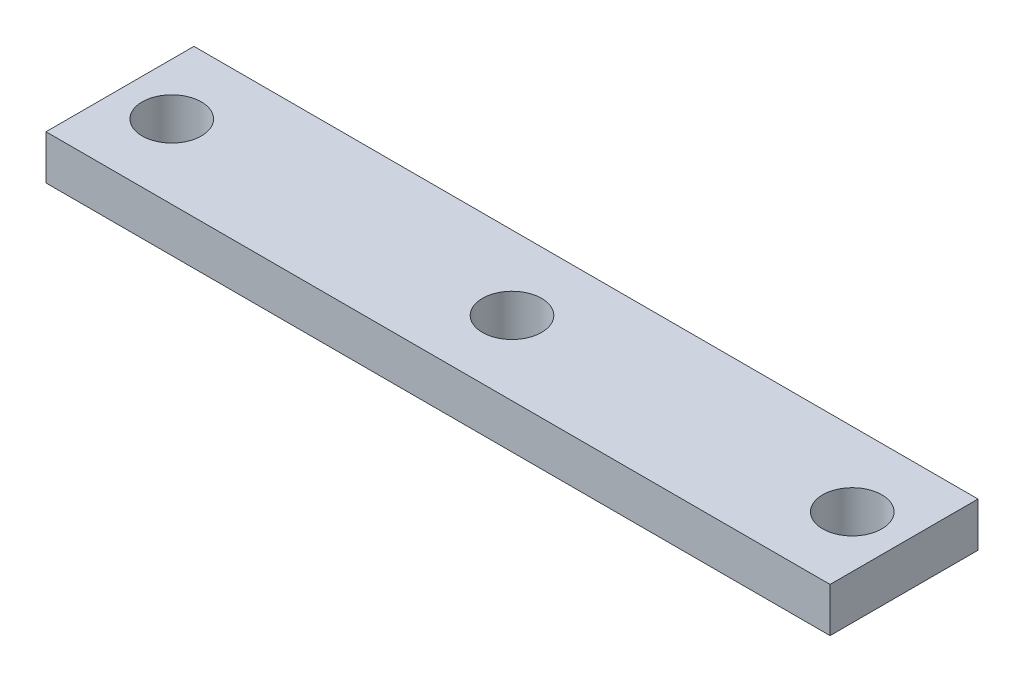
ISO-10303-21;
HEADER;
FILE_DESCRIPTION(('STEP AP214'),'2;1');
FILE_NAME('part.step','',(''),(''),'','','');
FILE_SCHEMA(('AUTOMOTIVE_DESIGN { 1 0 10303 214 1 1 1 1 }'));
ENDSEC;
DATA;
#1=APPLICATION_CONTEXT('core data for automotive mechanical design processes');
#2=APPLICATION_PROTOCOL_DEFINITION('international standard','automotive_design',2000,#1);
#3=PRODUCT_CONTEXT('',#1,'mechanical');
#4=PRODUCT('Part','Part','',(#3));
#5=PRODUCT_RELATED_PRODUCT_CATEGORY('part','',(#4));
#6=PRODUCT_DEFINITION_FORMATION('','',#4);
#7=PRODUCT_DEFINITION_CONTEXT('part definition',#1,'design');
#8=PRODUCT_DEFINITION('design','',#6,#7);
#9=PRODUCT_DEFINITION_SHAPE('','',#8);
#10=(LENGTH_UNIT() NAMED_UNIT(*) SI_UNIT(.MILLI.,.METRE.));
#11=(NAMED_UNIT(*) PLANE_ANGLE_UNIT() SI_UNIT($,.RADIAN.));
#12=(NAMED_UNIT(*) SI_UNIT($,.STERADIAN.) SOLID_ANGLE_UNIT());
#13=UNCERTAINTY_MEASURE_WITH_UNIT(LENGTH_MEASURE(1.E-05),#10,'distance_accuracy_value','');
#14=(GEOMETRIC_REPRESENTATION_CONTEXT(3) GLOBAL_UNCERTAINTY_ASSIGNED_CONTEXT((#13)) GLOBAL_UNIT_ASSIGNED_CONTEXT((#10,
#11,#12)) REPRESENTATION_CONTEXT('',''));
#15=CARTESIAN_POINT('',(0.,0.,0.));
#16=DIRECTION('',(0.,0.,1.));
#17=DIRECTION('',(1.,0.,0.));
#18=AXIS2_PLACEMENT_3D('',#15,#16,#17);
#19=CARTESIAN_POINT('',(0.,3.,0.));
#20=DIRECTION('',(0.,-1.,0.));
#21=DIRECTION('',(0.,0.,-1.));
#22=AXIS2_PLACEMENT_3D('',#19,#20,#21);
#23=PLANE('',#22);
#24=DIRECTION('',(0.,0.,-1.));
#25=VECTOR('',#24,1.);
#26=CARTESIAN_POINT('',(26.5,3.,5.));
#27=LINE('',#26,#25);
#28=CARTESIAN_POINT('',(26.5,3.,5.));
#29=VERTEX_POINT('',#28);
#30=CARTESIAN_POINT('',(26.5,3.,-5.));
#31=VERTEX_POINT('',#30);
#32=EDGE_CURVE('E85',#29,#31,#27,.T.);
#33=ORIENTED_EDGE('',*,*,#32,.T.);
#34=DIRECTION('',(-1.,0.,0.));
#35=VECTOR('',#34,1.);
#36=CARTESIAN_POINT('',(-26.5,3.,-5.));
#37=LINE('',#36,#35);
#38=CARTESIAN_POINT('',(-26.5,3.,-5.));
#39=VERTEX_POINT('',#38);
#40=EDGE_CURVE('E80',#31,#39,#37,.T.);
#41=ORIENTED_EDGE('',*,*,#40,.T.);
#42=DIRECTION('',(0.,0.,1.));
#43=VECTOR('',#42,1.);
#44=CARTESIAN_POINT('',(-26.5,3.,5.));
#45=LINE('',#44,#43);
#46=CARTESIAN_POINT('',(-26.5,3.,5.));
#47=VERTEX_POINT('',#46);
#48=EDGE_CURVE('E83',#39,#47,#45,.T.);
#49=ORIENTED_EDGE('',*,*,#48,.T.);
#50=DIRECTION('',(1.,0.,0.));
#51=VECTOR('',#50,1.);
#52=CARTESIAN_POINT('',(-26.5,3.,5.));
#53=LINE('',#52,#51);
#54=EDGE_CURVE('E50',#47,#29,#53,.T.);
#55=ORIENTED_EDGE('',*,*,#54,.T.);
#56=EDGE_LOOP('',(#33,#41,#49,#55));
#57=FACE_BOUND('',#56,.T.);
#58=CARTESIAN_POINT('',(-23.,3.,0.));
#59=DIRECTION('',(0.,1.,0.));
#60=DIRECTION('',(0.,0.,1.));
#61=AXIS2_PLACEMENT_3D('',#58,#59,#60);
#62=CIRCLE('',#61,2.00000000000001);
#63=CARTESIAN_POINT('',(-23.,3.,2.00000000000001));
#64=VERTEX_POINT('',#63);
#65=EDGE_CURVE('E100',#64,#64,#62,.T.);
#66=ORIENTED_EDGE('',*,*,#65,.F.);
#67=EDGE_LOOP('',(#66));
#68=FACE_BOUND('',#67,.T.);
#69=CARTESIAN_POINT('',(23.,3.,0.));
#70=DIRECTION('',(0.,1.,0.));
#71=DIRECTION('',(0.,0.,1.));
#72=AXIS2_PLACEMENT_3D('',#69,#70,#71);
#73=CIRCLE('',#72,2.00000000000001);
#74=CARTESIAN_POINT('',(23.,3.,2.));
#75=VERTEX_POINT('',#74);
#76=EDGE_CURVE('E115',#75,#75,#73,.T.);
#77=ORIENTED_EDGE('',*,*,#76,.F.);
#78=EDGE_LOOP('',(#77));
#79=FACE_BOUND('',#78,.T.);
#80=CARTESIAN_POINT('',(0.,3.,0.));
#81=DIRECTION('',(0.,1.,0.));
#82=DIRECTION('',(0.,0.,1.));
#83=AXIS2_PLACEMENT_3D('',#80,#81,#82);
#84=CIRCLE('',#83,2.);
#85=CARTESIAN_POINT('',(0.,3.,2.));
#86=VERTEX_POINT('',#85);
#87=EDGE_CURVE('E121',#86,#86,#84,.T.);
#88=ORIENTED_EDGE('',*,*,#87,.F.);
#89=EDGE_LOOP('',(#88));
#90=FACE_BOUND('',#89,.T.);
#91=ADVANCED_FACE('F33',(#57,#68,#79,#90),#23,.F.);
#92=CARTESIAN_POINT('',(0.,0.,0.));
#93=DIRECTION('',(0.,-1.,0.));
#94=DIRECTION('',(0.,0.,-1.));
#95=AXIS2_PLACEMENT_3D('',#92,#93,#94);
#96=PLANE('',#95);
#97=CARTESIAN_POINT('',(23.,0.,0.));
#98=DIRECTION('',(0.,1.,0.));
#99=DIRECTION('',(0.,0.,1.));
#100=AXIS2_PLACEMENT_3D('',#97,#98,#99);
#101=CIRCLE('',#100,2.00000000000001);
#102=CARTESIAN_POINT('',(23.,0.,2.));
#103=VERTEX_POINT('',#102);
#104=EDGE_CURVE('E118',#103,#103,#101,.T.);
#105=ORIENTED_EDGE('',*,*,#104,.T.);
#106=EDGE_LOOP('',(#105));
#107=FACE_BOUND('',#106,.T.);
#108=DIRECTION('',(0.,0.,-1.));
#109=VECTOR('',#108,1.);
#110=CARTESIAN_POINT('',(26.5,0.,5.));
#111=LINE('',#110,#109);
#112=CARTESIAN_POINT('',(26.5,0.,5.));
#113=VERTEX_POINT('',#112);
#114=CARTESIAN_POINT('',(26.5,0.,-5.));
#115=VERTEX_POINT('',#114);
#116=EDGE_CURVE('E97',#113,#115,#111,.T.);
#117=ORIENTED_EDGE('',*,*,#116,.F.);
#118=DIRECTION('',(1.,0.,0.));
#119=VECTOR('',#118,1.);
#120=CARTESIAN_POINT('',(-26.5,0.,5.));
#121=LINE('',#120,#119);
#122=CARTESIAN_POINT('',(-26.5,0.,5.));
#123=VERTEX_POINT('',#122);
#124=EDGE_CURVE('E73',#123,#113,#121,.T.);
#125=ORIENTED_EDGE('',*,*,#124,.F.);
#126=DIRECTION('',(0.,0.,1.));
#127=VECTOR('',#126,1.);
#128=CARTESIAN_POINT('',(-26.5,0.,5.));
#129=LINE('',#128,#127);
#130=CARTESIAN_POINT('',(-26.5,0.,-5.));
#131=VERTEX_POINT('',#130);
#132=EDGE_CURVE('E67',#131,#123,#129,.T.);
#133=ORIENTED_EDGE('',*,*,#132,.F.);
#134=DIRECTION('',(-1.,0.,0.));
#135=VECTOR('',#134,1.);
#136=CARTESIAN_POINT('',(-26.5,0.,-5.));
#137=LINE('',#136,#135);
#138=EDGE_CURVE('E89',#115,#131,#137,.T.);
#139=ORIENTED_EDGE('',*,*,#138,.F.);
#140=EDGE_LOOP('',(#117,#125,#133,#139));
#141=FACE_BOUND('',#140,.T.);
#142=CARTESIAN_POINT('',(-23.,0.,0.));
#143=DIRECTION('',(0.,1.,0.));
#144=DIRECTION('',(0.,0.,1.));
#145=AXIS2_PLACEMENT_3D('',#142,#143,#144);
#146=CIRCLE('',#145,2.00000000000001);
#147=CARTESIAN_POINT('',(-23.,0.,2.00000000000001));
#148=VERTEX_POINT('',#147);
#149=EDGE_CURVE('E112',#148,#148,#146,.T.);
#150=ORIENTED_EDGE('',*,*,#149,.T.);
#151=EDGE_LOOP('',(#150));
#152=FACE_BOUND('',#151,.T.);
#153=CARTESIAN_POINT('',(0.,0.,0.));
#154=DIRECTION('',(0.,1.,0.));
#155=DIRECTION('',(0.,0.,1.));
#156=AXIS2_PLACEMENT_3D('',#153,#154,#155);
#157=CIRCLE('',#156,2.);
#158=CARTESIAN_POINT('',(0.,0.,2.));
#159=VERTEX_POINT('',#158);
#160=EDGE_CURVE('E124',#159,#159,#157,.T.);
#161=ORIENTED_EDGE('',*,*,#160,.T.);
#162=EDGE_LOOP('',(#161));
#163=FACE_BOUND('',#162,.T.);
#164=ADVANCED_FACE('F108',(#107,#141,#152,#163),#96,.T.);
#165=CARTESIAN_POINT('',(26.5,3.,5.));
#166=DIRECTION('',(-1.,0.,0.));
#167=DIRECTION('',(0.,0.,1.));
#168=AXIS2_PLACEMENT_3D('',#165,#166,#167);
#169=PLANE('',#168);
#170=ORIENTED_EDGE('',*,*,#116,.T.);
#171=DIRECTION('',(0.,-1.,0.));
#172=VECTOR('',#171,1.);
#173=CARTESIAN_POINT('',(26.5,3.,-5.));
#174=LINE('',#173,#172);
#175=EDGE_CURVE('E11',#31,#115,#174,.T.);
#176=ORIENTED_EDGE('',*,*,#175,.F.);
#177=ORIENTED_EDGE('',*,*,#32,.F.);
#178=DIRECTION('',(0.,-1.,0.));
#179=VECTOR('',#178,1.);
#180=CARTESIAN_POINT('',(26.5,3.,5.));
#181=LINE('',#180,#179);
#182=EDGE_CURVE('E93',#29,#113,#181,.T.);
#183=ORIENTED_EDGE('',*,*,#182,.T.);
#184=EDGE_LOOP('',(#170,#176,#177,#183));
#185=FACE_BOUND('',#184,.T.);
#186=ADVANCED_FACE('F35',(#185),#169,.F.);
#187=CARTESIAN_POINT('',(-26.5,3.,-5.));
#188=DIRECTION('',(0.,0.,1.));
#189=DIRECTION('',(1.,0.,0.));
#190=AXIS2_PLACEMENT_3D('',#187,#188,#189);
#191=PLANE('',#190);
#192=ORIENTED_EDGE('',*,*,#138,.T.);
#193=DIRECTION('',(0.,-1.,0.));
#194=VECTOR('',#193,1.);
#195=CARTESIAN_POINT('',(-26.5,3.,-5.));
#196=LINE('',#195,#194);
#197=EDGE_CURVE('E42',#39,#131,#196,.T.);
#198=ORIENTED_EDGE('',*,*,#197,.F.);
#199=ORIENTED_EDGE('',*,*,#40,.F.);
#200=ORIENTED_EDGE('',*,*,#175,.T.);
#201=EDGE_LOOP('',(#192,#198,#199,#200));
#202=FACE_BOUND('',#201,.T.);
#203=ADVANCED_FACE('F88',(#202),#191,.F.);
#204=CARTESIAN_POINT('',(-26.5,3.,5.));
#205=DIRECTION('',(1.,0.,0.));
#206=DIRECTION('',(0.,0.,-1.));
#207=AXIS2_PLACEMENT_3D('',#204,#205,#206);
#208=PLANE('',#207);
#209=ORIENTED_EDGE('',*,*,#132,.T.);
#210=DIRECTION('',(0.,-1.,0.));
#211=VECTOR('',#210,1.);
#212=CARTESIAN_POINT('',(-26.5,3.,5.));
#213=LINE('',#212,#211);
#214=EDGE_CURVE('E90',#47,#123,#213,.T.);
#215=ORIENTED_EDGE('',*,*,#214,.F.);
#216=ORIENTED_EDGE('',*,*,#48,.F.);
#217=ORIENTED_EDGE('',*,*,#197,.T.);
#218=EDGE_LOOP('',(#209,#215,#216,#217));
#219=FACE_BOUND('',#218,.T.);
#220=ADVANCED_FACE('F91',(#219),#208,.F.);
#221=CARTESIAN_POINT('',(-26.5,3.,5.));
#222=DIRECTION('',(0.,0.,-1.));
#223=DIRECTION('',(-1.,0.,0.));
#224=AXIS2_PLACEMENT_3D('',#221,#222,#223);
#225=PLANE('',#224);
#226=ORIENTED_EDGE('',*,*,#124,.T.);
#227=ORIENTED_EDGE('',*,*,#182,.F.);
#228=ORIENTED_EDGE('',*,*,#54,.F.);
#229=ORIENTED_EDGE('',*,*,#214,.T.);
#230=EDGE_LOOP('',(#226,#227,#228,#229));
#231=FACE_BOUND('',#230,.T.);
#232=ADVANCED_FACE('F105',(#231),#225,.F.);
#233=CARTESIAN_POINT('',(-23.,3.,0.));
#234=DIRECTION('',(0.,-1.,0.));
#235=DIRECTION('',(0.,0.,-1.));
#236=AXIS2_PLACEMENT_3D('',#233,#234,#235);
#237=CYLINDRICAL_SURFACE('',#236,2.00000000000001);
#238=ORIENTED_EDGE('',*,*,#65,.T.);
#239=EDGE_LOOP('',(#238));
#240=FACE_BOUND('',#239,.T.);
#241=ORIENTED_EDGE('',*,*,#149,.F.);
#242=EDGE_LOOP('',(#241));
#243=FACE_BOUND('',#242,.T.);
#244=ADVANCED_FACE('F141',(#240,#243),#237,.F.);
#245=CARTESIAN_POINT('',(23.,3.,0.));
#246=DIRECTION('',(0.,-1.,0.));
#247=DIRECTION('',(0.,0.,-1.));
#248=AXIS2_PLACEMENT_3D('',#245,#246,#247);
#249=CYLINDRICAL_SURFACE('',#248,2.00000000000001);
#250=ORIENTED_EDGE('',*,*,#76,.T.);
#251=EDGE_LOOP('',(#250));
#252=FACE_BOUND('',#251,.T.);
#253=ORIENTED_EDGE('',*,*,#104,.F.);
#254=EDGE_LOOP('',(#253));
#255=FACE_BOUND('',#254,.T.);
#256=ADVANCED_FACE('F187',(#252,#255),#249,.F.);
#257=CARTESIAN_POINT('',(0.,3.,0.));
#258=DIRECTION('',(0.,-1.,0.));
#259=DIRECTION('',(0.,0.,-1.));
#260=AXIS2_PLACEMENT_3D('',#257,#258,#259);
#261=CYLINDRICAL_SURFACE('',#260,2.);
#262=ORIENTED_EDGE('',*,*,#87,.T.);
#263=EDGE_LOOP('',(#262));
#264=FACE_BOUND('',#263,.T.);
#265=ORIENTED_EDGE('',*,*,#160,.F.);
#266=EDGE_LOOP('',(#265));
#267=FACE_BOUND('',#266,.T.);
#268=ADVANCED_FACE('F130',(#264,#267),#261,.F.);
#269=CLOSED_SHELL('',(#91,#164,#186,#203,#220,#232,#244,#256,#268));
#270=MANIFOLD_SOLID_BREP('B2',#269);
#271=ADVANCED_BREP_SHAPE_REPRESENTATION('',(#18,#270),#14);
#272=SHAPE_DEFINITION_REPRESENTATION(#9,#271);
ENDSEC;
END-ISO-10303-21;
